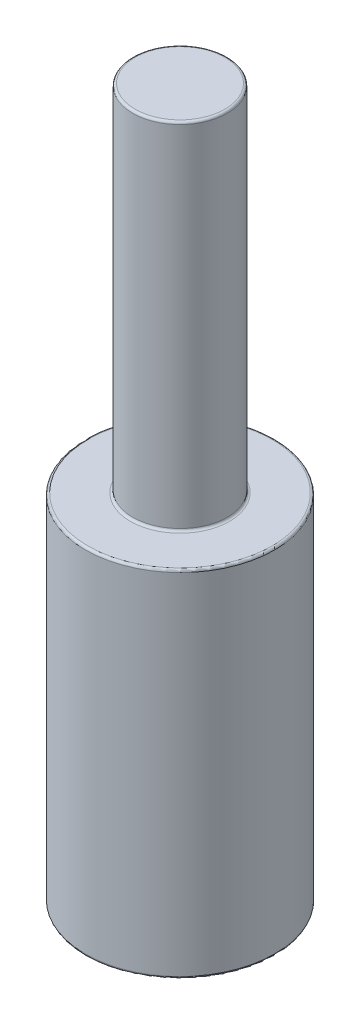
ISO-10303-21;
HEADER;
FILE_DESCRIPTION(('STEP AP214'),'2;1');
FILE_NAME('part.step','',(''),(''),'','','');
FILE_SCHEMA(('AUTOMOTIVE_DESIGN { 1 0 10303 214 1 1 1 1 }'));
ENDSEC;
DATA;
#1=APPLICATION_CONTEXT('core data for automotive mechanical design processes');
#2=APPLICATION_PROTOCOL_DEFINITION('international standard','automotive_design',2000,#1);
#3=PRODUCT_CONTEXT('',#1,'mechanical');
#4=PRODUCT('Part','Part','',(#3));
#5=PRODUCT_RELATED_PRODUCT_CATEGORY('part','',(#4));
#6=PRODUCT_DEFINITION_FORMATION('','',#4);
#7=PRODUCT_DEFINITION_CONTEXT('part definition',#1,'design');
#8=PRODUCT_DEFINITION('design','',#6,#7);
#9=PRODUCT_DEFINITION_SHAPE('','',#8);
#10=(LENGTH_UNIT() NAMED_UNIT(*) SI_UNIT(.MILLI.,.METRE.));
#11=(NAMED_UNIT(*) PLANE_ANGLE_UNIT() SI_UNIT($,.RADIAN.));
#12=(NAMED_UNIT(*) SI_UNIT($,.STERADIAN.) SOLID_ANGLE_UNIT());
#13=UNCERTAINTY_MEASURE_WITH_UNIT(LENGTH_MEASURE(1.E-05),#10,'distance_accuracy_value','');
#14=(GEOMETRIC_REPRESENTATION_CONTEXT(3) GLOBAL_UNCERTAINTY_ASSIGNED_CONTEXT((#13)) GLOBAL_UNIT_ASSIGNED_CONTEXT((#10,
#11,#12)) REPRESENTATION_CONTEXT('',''));
#15=CARTESIAN_POINT('',(0.,0.,0.));
#16=DIRECTION('',(0.,0.,1.));
#17=DIRECTION('',(1.,0.,0.));
#18=AXIS2_PLACEMENT_3D('',#15,#16,#17);
#19=CARTESIAN_POINT('',(0.,300.,0.));
#20=DIRECTION('',(0.,-1.,0.));
#21=DIRECTION('',(0.,0.,-1.));
#22=AXIS2_PLACEMENT_3D('',#19,#20,#21);
#23=CYLINDRICAL_SURFACE('',#22,40.);
#24=CARTESIAN_POINT('',(0.,149.,0.));
#25=DIRECTION('',(0.,1.,0.));
#26=DIRECTION('',(0.,0.,1.));
#27=AXIS2_PLACEMENT_3D('',#24,#25,#26);
#28=CIRCLE('',#27,40.);
#29=CARTESIAN_POINT('',(0.,149.,40.));
#30=VERTEX_POINT('',#29);
#31=EDGE_CURVE('E12',#30,#30,#28,.F.);
#32=ORIENTED_EDGE('',*,*,#31,.T.);
#33=EDGE_LOOP('',(#32));
#34=FACE_BOUND('',#33,.T.);
#35=CARTESIAN_POINT('',(0.,1.,0.));
#36=DIRECTION('',(0.,1.,0.));
#37=DIRECTION('',(0.,0.,1.));
#38=AXIS2_PLACEMENT_3D('',#35,#36,#37);
#39=CIRCLE('',#38,40.);
#40=CARTESIAN_POINT('',(0.,1.,40.));
#41=VERTEX_POINT('',#40);
#42=EDGE_CURVE('E64',#41,#41,#39,.T.);
#43=ORIENTED_EDGE('',*,*,#42,.T.);
#44=EDGE_LOOP('',(#43));
#45=FACE_BOUND('',#44,.T.);
#46=ADVANCED_FACE('F49',(#34,#45),#23,.T.);
#47=CARTESIAN_POINT('',(0.,0.,0.));
#48=DIRECTION('',(0.,1.,0.));
#49=DIRECTION('',(0.,0.,1.));
#50=AXIS2_PLACEMENT_3D('',#47,#48,#49);
#51=PLANE('',#50);
#52=CARTESIAN_POINT('',(0.,0.,0.));
#53=DIRECTION('',(0.,1.,0.));
#54=DIRECTION('',(0.,0.,1.));
#55=AXIS2_PLACEMENT_3D('',#52,#53,#54);
#56=CIRCLE('',#55,39.);
#57=CARTESIAN_POINT('',(0.,0.,39.));
#58=VERTEX_POINT('',#57);
#59=EDGE_CURVE('E60',#58,#58,#56,.F.);
#60=ORIENTED_EDGE('',*,*,#59,.T.);
#61=EDGE_LOOP('',(#60));
#62=FACE_BOUND('',#61,.T.);
#63=ADVANCED_FACE('F102',(#62),#51,.F.);
#64=CARTESIAN_POINT('',(0.,150.,0.));
#65=DIRECTION('',(0.,1.,0.));
#66=DIRECTION('',(0.,0.,1.));
#67=AXIS2_PLACEMENT_3D('',#64,#65,#66);
#68=PLANE('',#67);
#69=CARTESIAN_POINT('',(0.,150.,0.));
#70=DIRECTION('',(0.,1.,0.));
#71=DIRECTION('',(0.,0.,1.));
#72=AXIS2_PLACEMENT_3D('',#69,#70,#71);
#73=CIRCLE('',#72,39.);
#74=CARTESIAN_POINT('',(0.,150.,39.));
#75=VERTEX_POINT('',#74);
#76=EDGE_CURVE('E56',#75,#75,#73,.T.);
#77=ORIENTED_EDGE('',*,*,#76,.T.);
#78=EDGE_LOOP('',(#77));
#79=FACE_BOUND('',#78,.T.);
#80=CARTESIAN_POINT('',(0.,150.,0.));
#81=DIRECTION('',(0.,1.,0.));
#82=DIRECTION('',(0.,0.,1.));
#83=AXIS2_PLACEMENT_3D('',#80,#81,#82);
#84=CIRCLE('',#83,21.);
#85=CARTESIAN_POINT('',(0.,150.,21.));
#86=VERTEX_POINT('',#85);
#87=EDGE_CURVE('E75',#86,#86,#84,.F.);
#88=ORIENTED_EDGE('',*,*,#87,.T.);
#89=EDGE_LOOP('',(#88));
#90=FACE_BOUND('',#89,.T.);
#91=ADVANCED_FACE('F106',(#79,#90),#68,.T.);
#92=CARTESIAN_POINT('',(0.,150.,0.));
#93=DIRECTION('',(0.,1.,0.));
#94=DIRECTION('',(0.,0.,1.));
#95=AXIS2_PLACEMENT_3D('',#92,#93,#94);
#96=CYLINDRICAL_SURFACE('',#95,20.);
#97=CARTESIAN_POINT('',(0.,299.,0.));
#98=DIRECTION('',(0.,1.,0.));
#99=DIRECTION('',(0.,0.,1.));
#100=AXIS2_PLACEMENT_3D('',#97,#98,#99);
#101=CIRCLE('',#100,20.);
#102=CARTESIAN_POINT('',(0.,299.,20.));
#103=VERTEX_POINT('',#102);
#104=EDGE_CURVE('E69',#103,#103,#101,.F.);
#105=ORIENTED_EDGE('',*,*,#104,.T.);
#106=EDGE_LOOP('',(#105));
#107=FACE_BOUND('',#106,.T.);
#108=CARTESIAN_POINT('',(0.,151.,0.));
#109=DIRECTION('',(0.,1.,0.));
#110=DIRECTION('',(0.,0.,1.));
#111=AXIS2_PLACEMENT_3D('',#108,#109,#110);
#112=CIRCLE('',#111,20.);
#113=CARTESIAN_POINT('',(0.,151.,20.));
#114=VERTEX_POINT('',#113);
#115=EDGE_CURVE('E78',#114,#114,#112,.T.);
#116=ORIENTED_EDGE('',*,*,#115,.T.);
#117=EDGE_LOOP('',(#116));
#118=FACE_BOUND('',#117,.T.);
#119=ADVANCED_FACE('F82',(#107,#118),#96,.T.);
#120=CARTESIAN_POINT('',(0.,300.,0.));
#121=DIRECTION('',(0.,1.,0.));
#122=DIRECTION('',(0.,0.,1.));
#123=AXIS2_PLACEMENT_3D('',#120,#121,#122);
#124=PLANE('',#123);
#125=CARTESIAN_POINT('',(0.,300.,0.));
#126=DIRECTION('',(0.,1.,0.));
#127=DIRECTION('',(0.,0.,1.));
#128=AXIS2_PLACEMENT_3D('',#125,#126,#127);
#129=CIRCLE('',#128,19.);
#130=CARTESIAN_POINT('',(0.,300.,19.));
#131=VERTEX_POINT('',#130);
#132=EDGE_CURVE('E72',#131,#131,#129,.T.);
#133=ORIENTED_EDGE('',*,*,#132,.T.);
#134=EDGE_LOOP('',(#133));
#135=FACE_BOUND('',#134,.T.);
#136=ADVANCED_FACE('F87',(#135),#124,.T.);
#137=CARTESIAN_POINT('',(0.,151.,0.));
#138=DIRECTION('',(0.,1.,0.));
#139=DIRECTION('',(0.,0.,1.));
#140=AXIS2_PLACEMENT_3D('',#137,#138,#139);
#141=TOROIDAL_SURFACE('',#140,21.,1.);
#142=ORIENTED_EDGE('',*,*,#87,.F.);
#143=EDGE_LOOP('',(#142));
#144=FACE_BOUND('',#143,.T.);
#145=ORIENTED_EDGE('',*,*,#115,.F.);
#146=EDGE_LOOP('',(#145));
#147=FACE_BOUND('',#146,.T.);
#148=ADVANCED_FACE('F84',(#144,#147),#141,.F.);
#149=CARTESIAN_POINT('',(0.,299.,0.));
#150=DIRECTION('',(0.,1.,0.));
#151=DIRECTION('',(0.,0.,1.));
#152=AXIS2_PLACEMENT_3D('',#149,#150,#151);
#153=TOROIDAL_SURFACE('',#152,19.,1.);
#154=ORIENTED_EDGE('',*,*,#104,.F.);
#155=EDGE_LOOP('',(#154));
#156=FACE_BOUND('',#155,.T.);
#157=ORIENTED_EDGE('',*,*,#132,.F.);
#158=EDGE_LOOP('',(#157));
#159=FACE_BOUND('',#158,.T.);
#160=ADVANCED_FACE('F86',(#156,#159),#153,.T.);
#161=CARTESIAN_POINT('',(0.,1.,0.));
#162=DIRECTION('',(0.,1.,0.));
#163=DIRECTION('',(0.,0.,1.));
#164=AXIS2_PLACEMENT_3D('',#161,#162,#163);
#165=TOROIDAL_SURFACE('',#164,39.,1.);
#166=ORIENTED_EDGE('',*,*,#59,.F.);
#167=EDGE_LOOP('',(#166));
#168=FACE_BOUND('',#167,.T.);
#169=ORIENTED_EDGE('',*,*,#42,.F.);
#170=EDGE_LOOP('',(#169));
#171=FACE_BOUND('',#170,.T.);
#172=ADVANCED_FACE('F94',(#168,#171),#165,.T.);
#173=CARTESIAN_POINT('',(0.,149.,0.));
#174=DIRECTION('',(0.,1.,0.));
#175=DIRECTION('',(0.,0.,1.));
#176=AXIS2_PLACEMENT_3D('',#173,#174,#175);
#177=TOROIDAL_SURFACE('',#176,39.,1.);
#178=ORIENTED_EDGE('',*,*,#31,.F.);
#179=EDGE_LOOP('',(#178));
#180=FACE_BOUND('',#179,.T.);
#181=ORIENTED_EDGE('',*,*,#76,.F.);
#182=EDGE_LOOP('',(#181));
#183=FACE_BOUND('',#182,.T.);
#184=ADVANCED_FACE('F51',(#180,#183),#177,.T.);
#185=CLOSED_SHELL('',(#46,#63,#91,#119,#136,#148,#160,#172,#184));
#186=MANIFOLD_SOLID_BREP('B2',#185);
#187=ADVANCED_BREP_SHAPE_REPRESENTATION('',(#18,#186),#14);
#188=SHAPE_DEFINITION_REPRESENTATION(#9,#187);
ENDSEC;
END-ISO-10303-21;
